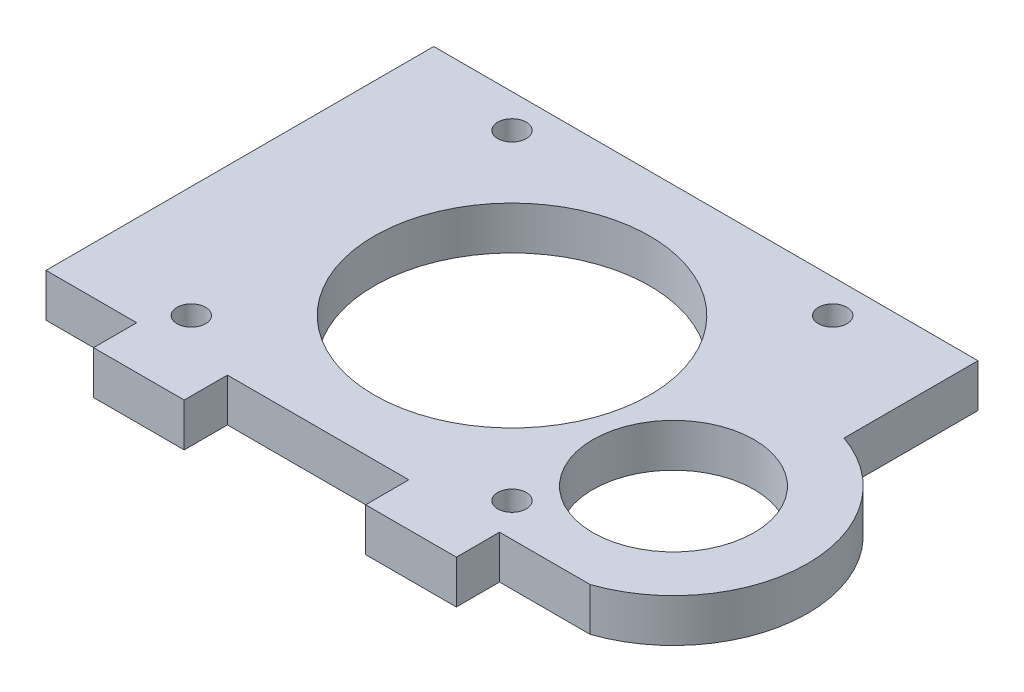
ISO-10303-21;
HEADER;
FILE_DESCRIPTION(('STEP AP214'),'2;1');
FILE_NAME('part.step','',(''),(''),'','','');
FILE_SCHEMA(('AUTOMOTIVE_DESIGN { 1 0 10303 214 1 1 1 1 }'));
ENDSEC;
DATA;
#1=APPLICATION_CONTEXT('core data for automotive mechanical design processes');
#2=APPLICATION_PROTOCOL_DEFINITION('international standard','automotive_design',2000,#1);
#3=PRODUCT_CONTEXT('',#1,'mechanical');
#4=PRODUCT('Part','Part','',(#3));
#5=PRODUCT_RELATED_PRODUCT_CATEGORY('part','',(#4));
#6=PRODUCT_DEFINITION_FORMATION('','',#4);
#7=PRODUCT_DEFINITION_CONTEXT('part definition',#1,'design');
#8=PRODUCT_DEFINITION('design','',#6,#7);
#9=PRODUCT_DEFINITION_SHAPE('','',#8);
#10=(LENGTH_UNIT() NAMED_UNIT(*) SI_UNIT(.MILLI.,.METRE.));
#11=(NAMED_UNIT(*) PLANE_ANGLE_UNIT() SI_UNIT($,.RADIAN.));
#12=(NAMED_UNIT(*) SI_UNIT($,.STERADIAN.) SOLID_ANGLE_UNIT());
#13=UNCERTAINTY_MEASURE_WITH_UNIT(LENGTH_MEASURE(1.E-05),#10,'distance_accuracy_value','');
#14=(GEOMETRIC_REPRESENTATION_CONTEXT(3) GLOBAL_UNCERTAINTY_ASSIGNED_CONTEXT((#13)) GLOBAL_UNIT_ASSIGNED_CONTEXT((#10,
#11,#12)) REPRESENTATION_CONTEXT('',''));
#15=CARTESIAN_POINT('',(0.,0.,0.));
#16=DIRECTION('',(0.,0.,1.));
#17=DIRECTION('',(1.,0.,0.));
#18=AXIS2_PLACEMENT_3D('',#15,#16,#17);
#19=CARTESIAN_POINT('',(-40.,6.35,31.675));
#20=DIRECTION('',(0.,0.,-1.));
#21=DIRECTION('',(-1.,0.,0.));
#22=AXIS2_PLACEMENT_3D('',#19,#20,#21);
#23=PLANE('',#22);
#24=DIRECTION('',(1.,0.,0.));
#25=VECTOR('',#24,1.);
#26=CARTESIAN_POINT('',(-40.,6.35,31.675));
#27=LINE('',#26,#25);
#28=CARTESIAN_POINT('',(-26.6666666666667,6.35,31.675));
#29=VERTEX_POINT('',#28);
#30=CARTESIAN_POINT('',(-13.3333333333333,6.35,31.675));
#31=VERTEX_POINT('',#30);
#32=EDGE_CURVE('E179',#29,#31,#27,.T.);
#33=ORIENTED_EDGE('',*,*,#32,.F.);
#34=DIRECTION('',(0.,1.,0.));
#35=VECTOR('',#34,1.);
#36=CARTESIAN_POINT('',(-26.6666666666667,0.,31.675));
#37=LINE('',#36,#35);
#38=CARTESIAN_POINT('',(-26.6666666666667,0.,31.675));
#39=VERTEX_POINT('',#38);
#40=EDGE_CURVE('E204',#39,#29,#37,.T.);
#41=ORIENTED_EDGE('',*,*,#40,.F.);
#42=DIRECTION('',(1.,0.,0.));
#43=VECTOR('',#42,1.);
#44=CARTESIAN_POINT('',(-40.,0.,31.675));
#45=LINE('',#44,#43);
#46=CARTESIAN_POINT('',(-13.3333333333333,0.,31.675));
#47=VERTEX_POINT('',#46);
#48=EDGE_CURVE('E163',#39,#47,#45,.T.);
#49=ORIENTED_EDGE('',*,*,#48,.T.);
#50=DIRECTION('',(0.,1.,0.));
#51=VECTOR('',#50,1.);
#52=CARTESIAN_POINT('',(-13.3333333333333,0.,31.675));
#53=LINE('',#52,#51);
#54=EDGE_CURVE('E206',#47,#31,#53,.T.);
#55=ORIENTED_EDGE('',*,*,#54,.T.);
#56=EDGE_LOOP('',(#33,#41,#49,#55));
#57=FACE_BOUND('',#56,.T.);
#58=ADVANCED_FACE('F45',(#57),#23,.F.);
#59=CARTESIAN_POINT('',(40.,6.35,-31.675));
#60=DIRECTION('',(-1.,0.,0.));
#61=DIRECTION('',(0.,0.,1.));
#62=AXIS2_PLACEMENT_3D('',#59,#60,#61);
#63=PLANE('',#62);
#64=DIRECTION('',(0.,0.,-1.));
#65=VECTOR('',#64,1.);
#66=CARTESIAN_POINT('',(40.,6.35,-31.675));
#67=LINE('',#66,#65);
#68=CARTESIAN_POINT('',(40.,6.35,-11.975));
#69=VERTEX_POINT('',#68);
#70=CARTESIAN_POINT('',(40.,6.35,-31.675));
#71=VERTEX_POINT('',#70);
#72=EDGE_CURVE('E144',#69,#71,#67,.T.);
#73=ORIENTED_EDGE('',*,*,#72,.F.);
#74=DIRECTION('',(0.,-1.,0.));
#75=VECTOR('',#74,1.);
#76=CARTESIAN_POINT('',(40.,45.9528379593739,-11.975));
#77=LINE('',#76,#75);
#78=CARTESIAN_POINT('',(40.,0.,-11.975));
#79=VERTEX_POINT('',#78);
#80=EDGE_CURVE('E152',#69,#79,#77,.T.);
#81=ORIENTED_EDGE('',*,*,#80,.T.);
#82=DIRECTION('',(0.,0.,-1.));
#83=VECTOR('',#82,1.);
#84=CARTESIAN_POINT('',(40.,0.,-31.675));
#85=LINE('',#84,#83);
#86=CARTESIAN_POINT('',(40.,0.,-31.675));
#87=VERTEX_POINT('',#86);
#88=EDGE_CURVE('E180',#79,#87,#85,.T.);
#89=ORIENTED_EDGE('',*,*,#88,.T.);
#90=DIRECTION('',(0.,-1.,0.));
#91=VECTOR('',#90,1.);
#92=CARTESIAN_POINT('',(40.,6.35,-31.675));
#93=LINE('',#92,#91);
#94=EDGE_CURVE('E11',#71,#87,#93,.T.);
#95=ORIENTED_EDGE('',*,*,#94,.F.);
#96=EDGE_LOOP('',(#73,#81,#89,#95));
#97=FACE_BOUND('',#96,.T.);
#98=ADVANCED_FACE('F47',(#97),#63,.F.);
#99=CARTESIAN_POINT('',(-40.,6.35,-31.675));
#100=DIRECTION('',(0.,0.,1.));
#101=DIRECTION('',(1.,0.,0.));
#102=AXIS2_PLACEMENT_3D('',#99,#100,#101);
#103=PLANE('',#102);
#104=DIRECTION('',(-1.,0.,0.));
#105=VECTOR('',#104,1.);
#106=CARTESIAN_POINT('',(-40.,0.,-31.675));
#107=LINE('',#106,#105);
#108=CARTESIAN_POINT('',(-40.,0.,-31.675));
#109=VERTEX_POINT('',#108);
#110=EDGE_CURVE('E182',#87,#109,#107,.T.);
#111=ORIENTED_EDGE('',*,*,#110,.T.);
#112=DIRECTION('',(0.,-1.,0.));
#113=VECTOR('',#112,1.);
#114=CARTESIAN_POINT('',(-40.,6.35,-31.675));
#115=LINE('',#114,#113);
#116=CARTESIAN_POINT('',(-40.,6.35,-31.675));
#117=VERTEX_POINT('',#116);
#118=EDGE_CURVE('E53',#117,#109,#115,.T.);
#119=ORIENTED_EDGE('',*,*,#118,.F.);
#120=DIRECTION('',(-1.,0.,0.));
#121=VECTOR('',#120,1.);
#122=CARTESIAN_POINT('',(-40.,6.35,-31.675));
#123=LINE('',#122,#121);
#124=EDGE_CURVE('E162',#71,#117,#123,.T.);
#125=ORIENTED_EDGE('',*,*,#124,.F.);
#126=ORIENTED_EDGE('',*,*,#94,.T.);
#127=EDGE_LOOP('',(#111,#119,#125,#126));
#128=FACE_BOUND('',#127,.T.);
#129=ADVANCED_FACE('F347',(#128),#103,.F.);
#130=CARTESIAN_POINT('',(-40.,6.35,-31.675));
#131=DIRECTION('',(1.,0.,0.));
#132=DIRECTION('',(0.,0.,-1.));
#133=AXIS2_PLACEMENT_3D('',#130,#131,#132);
#134=PLANE('',#133);
#135=DIRECTION('',(0.,0.,1.));
#136=VECTOR('',#135,1.);
#137=CARTESIAN_POINT('',(-40.,0.,-31.675));
#138=LINE('',#137,#136);
#139=CARTESIAN_POINT('',(-40.,0.,25.325));
#140=VERTEX_POINT('',#139);
#141=EDGE_CURVE('E185',#109,#140,#138,.T.);
#142=ORIENTED_EDGE('',*,*,#141,.T.);
#143=DIRECTION('',(0.,1.,0.));
#144=VECTOR('',#143,1.);
#145=CARTESIAN_POINT('',(-40.,0.,25.325));
#146=LINE('',#145,#144);
#147=CARTESIAN_POINT('',(-40.,6.35,25.325));
#148=VERTEX_POINT('',#147);
#149=EDGE_CURVE('E183',#140,#148,#146,.T.);
#150=ORIENTED_EDGE('',*,*,#149,.T.);
#151=DIRECTION('',(0.,0.,1.));
#152=VECTOR('',#151,1.);
#153=CARTESIAN_POINT('',(-40.,6.35,-31.675));
#154=LINE('',#153,#152);
#155=EDGE_CURVE('E165',#117,#148,#154,.T.);
#156=ORIENTED_EDGE('',*,*,#155,.F.);
#157=ORIENTED_EDGE('',*,*,#118,.T.);
#158=EDGE_LOOP('',(#142,#150,#156,#157));
#159=FACE_BOUND('',#158,.T.);
#160=ADVANCED_FACE('F350',(#159),#134,.F.);
#161=CARTESIAN_POINT('',(13.3333333333333,0.,31.675));
#162=VERTEX_POINT('',#161);
#163=CARTESIAN_POINT('',(26.6666666666667,0.,31.675));
#164=VERTEX_POINT('',#163);
#165=EDGE_CURVE('E168',#162,#164,#45,.T.);
#166=ORIENTED_EDGE('',*,*,#165,.T.);
#167=DIRECTION('',(0.,1.,0.));
#168=VECTOR('',#167,1.);
#169=CARTESIAN_POINT('',(26.6666666666667,0.,31.675));
#170=LINE('',#169,#168);
#171=CARTESIAN_POINT('',(26.6666666666667,6.35,31.675));
#172=VERTEX_POINT('',#171);
#173=EDGE_CURVE('E232',#164,#172,#170,.T.);
#174=ORIENTED_EDGE('',*,*,#173,.T.);
#175=CARTESIAN_POINT('',(13.3333333333333,6.35,31.675));
#176=VERTEX_POINT('',#175);
#177=EDGE_CURVE('E176',#176,#172,#27,.T.);
#178=ORIENTED_EDGE('',*,*,#177,.F.);
#179=DIRECTION('',(0.,1.,0.));
#180=VECTOR('',#179,1.);
#181=CARTESIAN_POINT('',(13.3333333333333,0.,31.675));
#182=LINE('',#181,#180);
#183=EDGE_CURVE('E211',#162,#176,#182,.T.);
#184=ORIENTED_EDGE('',*,*,#183,.F.);
#185=EDGE_LOOP('',(#166,#174,#178,#184));
#186=FACE_BOUND('',#185,.T.);
#187=ADVANCED_FACE('F248',(#186),#23,.F.);
#188=CARTESIAN_POINT('',(0.,6.35,0.));
#189=DIRECTION('',(0.,1.,0.));
#190=DIRECTION('',(0.,0.,1.));
#191=AXIS2_PLACEMENT_3D('',#188,#189,#190);
#192=PLANE('',#191);
#193=CARTESIAN_POINT('',(33.5853762819475,6.35,6.67500000000001));
#194=DIRECTION('',(0.,1.,0.));
#195=DIRECTION('',(0.,0.,1.));
#196=AXIS2_PLACEMENT_3D('',#193,#194,#195);
#197=CIRCLE('',#196,11.85);
#198=CARTESIAN_POINT('',(33.5853762819475,6.35,18.525));
#199=VERTEX_POINT('',#198);
#200=EDGE_CURVE('E301',#199,#199,#197,.T.);
#201=ORIENTED_EDGE('',*,*,#200,.F.);
#202=EDGE_LOOP('',(#201));
#203=FACE_BOUND('',#202,.T.);
#204=CARTESIAN_POINT('',(23.57,6.35,20.395));
#205=DIRECTION('',(0.,1.,0.));
#206=DIRECTION('',(0.,0.,1.));
#207=AXIS2_PLACEMENT_3D('',#204,#205,#206);
#208=CIRCLE('',#207,2.1);
#209=CARTESIAN_POINT('',(23.57,6.35,22.495));
#210=VERTEX_POINT('',#209);
#211=EDGE_CURVE('E286',#210,#210,#208,.T.);
#212=ORIENTED_EDGE('',*,*,#211,.F.);
#213=EDGE_LOOP('',(#212));
#214=FACE_BOUND('',#213,.T.);
#215=CARTESIAN_POINT('',(-23.57,6.35,20.395));
#216=DIRECTION('',(0.,1.,0.));
#217=DIRECTION('',(0.,0.,1.));
#218=AXIS2_PLACEMENT_3D('',#215,#216,#217);
#219=CIRCLE('',#218,2.1);
#220=CARTESIAN_POINT('',(-23.57,6.35,22.495));
#221=VERTEX_POINT('',#220);
#222=EDGE_CURVE('E292',#221,#221,#219,.T.);
#223=ORIENTED_EDGE('',*,*,#222,.F.);
#224=EDGE_LOOP('',(#223));
#225=FACE_BOUND('',#224,.T.);
#226=CARTESIAN_POINT('',(-23.57,6.35,-26.745));
#227=DIRECTION('',(0.,1.,0.));
#228=DIRECTION('',(0.,0.,1.));
#229=AXIS2_PLACEMENT_3D('',#226,#227,#228);
#230=CIRCLE('',#229,2.1);
#231=CARTESIAN_POINT('',(-23.57,6.35,-24.645));
#232=VERTEX_POINT('',#231);
#233=EDGE_CURVE('E281',#232,#232,#230,.T.);
#234=ORIENTED_EDGE('',*,*,#233,.F.);
#235=EDGE_LOOP('',(#234));
#236=FACE_BOUND('',#235,.T.);
#237=CARTESIAN_POINT('',(23.57,6.35,-26.745));
#238=DIRECTION('',(0.,1.,0.));
#239=DIRECTION('',(0.,0.,1.));
#240=AXIS2_PLACEMENT_3D('',#237,#238,#239);
#241=CIRCLE('',#240,2.1);
#242=CARTESIAN_POINT('',(23.57,6.35,-24.645));
#243=VERTEX_POINT('',#242);
#244=EDGE_CURVE('E278',#243,#243,#241,.T.);
#245=ORIENTED_EDGE('',*,*,#244,.F.);
#246=EDGE_LOOP('',(#245));
#247=FACE_BOUND('',#246,.T.);
#248=CARTESIAN_POINT('',(0.,6.35,-3.17499999999998));
#249=DIRECTION('',(0.,1.,0.));
#250=DIRECTION('',(0.,0.,1.));
#251=AXIS2_PLACEMENT_3D('',#248,#249,#250);
#252=CIRCLE('',#251,20.25);
#253=CARTESIAN_POINT('',(0.,6.35,17.075));
#254=VERTEX_POINT('',#253);
#255=EDGE_CURVE('E225',#254,#254,#252,.T.);
#256=ORIENTED_EDGE('',*,*,#255,.F.);
#257=EDGE_LOOP('',(#256));
#258=FACE_BOUND('',#257,.T.);
#259=DIRECTION('',(-1.,0.,0.));
#260=VECTOR('',#259,1.);
#261=CARTESIAN_POINT('',(-40.,6.35,25.325));
#262=LINE('',#261,#260);
#263=CARTESIAN_POINT('',(-26.6666666666667,6.35,25.325));
#264=VERTEX_POINT('',#263);
#265=EDGE_CURVE('E266',#264,#148,#262,.T.);
#266=ORIENTED_EDGE('',*,*,#265,.F.);
#267=DIRECTION('',(0.,0.,-1.));
#268=VECTOR('',#267,1.);
#269=CARTESIAN_POINT('',(-26.6666666666667,6.35,31.675));
#270=LINE('',#269,#268);
#271=EDGE_CURVE('E200',#29,#264,#270,.T.);
#272=ORIENTED_EDGE('',*,*,#271,.F.);
#273=ORIENTED_EDGE('',*,*,#32,.T.);
#274=DIRECTION('',(0.,0.,1.));
#275=VECTOR('',#274,1.);
#276=CARTESIAN_POINT('',(-13.3333333333333,6.35,31.675));
#277=LINE('',#276,#275);
#278=CARTESIAN_POINT('',(-13.3333333333333,6.35,25.325));
#279=VERTEX_POINT('',#278);
#280=EDGE_CURVE('E198',#279,#31,#277,.T.);
#281=ORIENTED_EDGE('',*,*,#280,.F.);
#282=DIRECTION('',(-1.,0.,0.));
#283=VECTOR('',#282,1.);
#284=CARTESIAN_POINT('',(-13.3333333333333,6.35,25.325));
#285=LINE('',#284,#283);
#286=CARTESIAN_POINT('',(13.3333333333333,6.35,25.325));
#287=VERTEX_POINT('',#286);
#288=EDGE_CURVE('E226',#287,#279,#285,.T.);
#289=ORIENTED_EDGE('',*,*,#288,.F.);
#290=DIRECTION('',(0.,0.,-1.));
#291=VECTOR('',#290,1.);
#292=CARTESIAN_POINT('',(13.3333333333333,6.35,31.675));
#293=LINE('',#292,#291);
#294=EDGE_CURVE('E229',#176,#287,#293,.T.);
#295=ORIENTED_EDGE('',*,*,#294,.F.);
#296=ORIENTED_EDGE('',*,*,#177,.T.);
#297=DIRECTION('',(0.,0.,1.));
#298=VECTOR('',#297,1.);
#299=CARTESIAN_POINT('',(26.6666666666667,6.35,31.675));
#300=LINE('',#299,#298);
#301=CARTESIAN_POINT('',(26.6666666666667,6.35,25.325));
#302=VERTEX_POINT('',#301);
#303=EDGE_CURVE('E255',#302,#172,#300,.T.);
#304=ORIENTED_EDGE('',*,*,#303,.F.);
#305=DIRECTION('',(-1.,0.,0.));
#306=VECTOR('',#305,1.);
#307=CARTESIAN_POINT('',(40.,6.35,25.325));
#308=LINE('',#307,#306);
#309=CARTESIAN_POINT('',(40.,6.35,25.325));
#310=VERTEX_POINT('',#309);
#311=EDGE_CURVE('E148',#310,#302,#308,.T.);
#312=ORIENTED_EDGE('',*,*,#311,.F.);
#313=CARTESIAN_POINT('',(33.5853762819475,6.35,6.67500000000001));
#314=DIRECTION('',(0.,1.,0.));
#315=DIRECTION('',(0.,0.,1.));
#316=AXIS2_PLACEMENT_3D('',#313,#314,#315);
#317=CIRCLE('',#316,19.7223197784693);
#318=EDGE_CURVE('E139',#69,#310,#317,.F.);
#319=ORIENTED_EDGE('',*,*,#318,.F.);
#320=ORIENTED_EDGE('',*,*,#72,.T.);
#321=ORIENTED_EDGE('',*,*,#124,.T.);
#322=ORIENTED_EDGE('',*,*,#155,.T.);
#323=EDGE_LOOP('',(#266,#272,#273,#281,#289,#295,#296,#304,#312,#319,#320,#321,#322));
#324=FACE_BOUND('',#323,.T.);
#325=ADVANCED_FACE('F142',(#203,#214,#225,#236,#247,#258,#324),#192,.T.);
#326=CARTESIAN_POINT('',(0.,0.,0.));
#327=DIRECTION('',(0.,1.,0.));
#328=DIRECTION('',(0.,0.,1.));
#329=AXIS2_PLACEMENT_3D('',#326,#327,#328);
#330=PLANE('',#329);
#331=CARTESIAN_POINT('',(33.5853762819475,0.,6.67500000000001));
#332=DIRECTION('',(0.,-1.,0.));
#333=DIRECTION('',(0.,0.,-1.));
#334=AXIS2_PLACEMENT_3D('',#331,#332,#333);
#335=CIRCLE('',#334,11.85);
#336=CARTESIAN_POINT('',(33.5853762819475,0.,-5.17499999999999));
#337=VERTEX_POINT('',#336);
#338=EDGE_CURVE('E304',#337,#337,#335,.T.);
#339=ORIENTED_EDGE('',*,*,#338,.F.);
#340=EDGE_LOOP('',(#339));
#341=FACE_BOUND('',#340,.T.);
#342=CARTESIAN_POINT('',(23.57,0.,20.395));
#343=DIRECTION('',(0.,1.,0.));
#344=DIRECTION('',(0.,0.,1.));
#345=AXIS2_PLACEMENT_3D('',#342,#343,#344);
#346=CIRCLE('',#345,2.1);
#347=CARTESIAN_POINT('',(23.57,0.,22.495));
#348=VERTEX_POINT('',#347);
#349=EDGE_CURVE('E151',#348,#348,#346,.T.);
#350=ORIENTED_EDGE('',*,*,#349,.T.);
#351=EDGE_LOOP('',(#350));
#352=FACE_BOUND('',#351,.T.);
#353=CARTESIAN_POINT('',(-23.57,0.,20.395));
#354=DIRECTION('',(0.,1.,0.));
#355=DIRECTION('',(0.,0.,1.));
#356=AXIS2_PLACEMENT_3D('',#353,#354,#355);
#357=CIRCLE('',#356,2.1);
#358=CARTESIAN_POINT('',(-23.57,0.,22.495));
#359=VERTEX_POINT('',#358);
#360=EDGE_CURVE('E289',#359,#359,#357,.T.);
#361=ORIENTED_EDGE('',*,*,#360,.T.);
#362=EDGE_LOOP('',(#361));
#363=FACE_BOUND('',#362,.T.);
#364=CARTESIAN_POINT('',(-23.57,0.,-26.745));
#365=DIRECTION('',(0.,1.,0.));
#366=DIRECTION('',(0.,0.,1.));
#367=AXIS2_PLACEMENT_3D('',#364,#365,#366);
#368=CIRCLE('',#367,2.1);
#369=CARTESIAN_POINT('',(-23.57,0.,-24.645));
#370=VERTEX_POINT('',#369);
#371=EDGE_CURVE('E295',#370,#370,#368,.T.);
#372=ORIENTED_EDGE('',*,*,#371,.T.);
#373=EDGE_LOOP('',(#372));
#374=FACE_BOUND('',#373,.T.);
#375=CARTESIAN_POINT('',(23.57,0.,-26.745));
#376=DIRECTION('',(0.,1.,0.));
#377=DIRECTION('',(0.,0.,1.));
#378=AXIS2_PLACEMENT_3D('',#375,#376,#377);
#379=CIRCLE('',#378,2.1);
#380=CARTESIAN_POINT('',(23.57,0.,-24.645));
#381=VERTEX_POINT('',#380);
#382=EDGE_CURVE('E277',#381,#381,#379,.T.);
#383=ORIENTED_EDGE('',*,*,#382,.T.);
#384=EDGE_LOOP('',(#383));
#385=FACE_BOUND('',#384,.T.);
#386=CARTESIAN_POINT('',(0.,0.,-3.17499999999998));
#387=DIRECTION('',(0.,1.,0.));
#388=DIRECTION('',(0.,0.,1.));
#389=AXIS2_PLACEMENT_3D('',#386,#387,#388);
#390=CIRCLE('',#389,20.25);
#391=CARTESIAN_POINT('',(0.,0.,17.075));
#392=VERTEX_POINT('',#391);
#393=EDGE_CURVE('E274',#392,#392,#390,.T.);
#394=ORIENTED_EDGE('',*,*,#393,.T.);
#395=EDGE_LOOP('',(#394));
#396=FACE_BOUND('',#395,.T.);
#397=DIRECTION('',(0.,0.,-1.));
#398=VECTOR('',#397,1.);
#399=CARTESIAN_POINT('',(-26.6666666666667,0.,31.675));
#400=LINE('',#399,#398);
#401=CARTESIAN_POINT('',(-26.6666666666667,0.,25.325));
#402=VERTEX_POINT('',#401);
#403=EDGE_CURVE('E268',#39,#402,#400,.T.);
#404=ORIENTED_EDGE('',*,*,#403,.T.);
#405=DIRECTION('',(-1.,0.,0.));
#406=VECTOR('',#405,1.);
#407=CARTESIAN_POINT('',(-40.,0.,25.325));
#408=LINE('',#407,#406);
#409=EDGE_CURVE('E60',#402,#140,#408,.T.);
#410=ORIENTED_EDGE('',*,*,#409,.T.);
#411=ORIENTED_EDGE('',*,*,#141,.F.);
#412=ORIENTED_EDGE('',*,*,#110,.F.);
#413=ORIENTED_EDGE('',*,*,#88,.F.);
#414=CARTESIAN_POINT('',(33.5853762819475,0.,6.67500000000001));
#415=DIRECTION('',(0.,-1.,0.));
#416=DIRECTION('',(0.,0.,-1.));
#417=AXIS2_PLACEMENT_3D('',#414,#415,#416);
#418=CIRCLE('',#417,19.7223197784693);
#419=CARTESIAN_POINT('',(40.,0.,25.325));
#420=VERTEX_POINT('',#419);
#421=EDGE_CURVE('E157',#79,#420,#418,.T.);
#422=ORIENTED_EDGE('',*,*,#421,.T.);
#423=DIRECTION('',(-1.,0.,0.));
#424=VECTOR('',#423,1.);
#425=CARTESIAN_POINT('',(40.,0.,25.325));
#426=LINE('',#425,#424);
#427=CARTESIAN_POINT('',(26.6666666666667,0.,25.325));
#428=VERTEX_POINT('',#427);
#429=EDGE_CURVE('E219',#420,#428,#426,.T.);
#430=ORIENTED_EDGE('',*,*,#429,.T.);
#431=DIRECTION('',(0.,0.,1.));
#432=VECTOR('',#431,1.);
#433=CARTESIAN_POINT('',(26.6666666666667,0.,31.675));
#434=LINE('',#433,#432);
#435=EDGE_CURVE('E68',#428,#164,#434,.T.);
#436=ORIENTED_EDGE('',*,*,#435,.T.);
#437=ORIENTED_EDGE('',*,*,#165,.F.);
#438=DIRECTION('',(0.,0.,-1.));
#439=VECTOR('',#438,1.);
#440=CARTESIAN_POINT('',(13.3333333333333,0.,31.675));
#441=LINE('',#440,#439);
#442=CARTESIAN_POINT('',(13.3333333333333,0.,25.325));
#443=VERTEX_POINT('',#442);
#444=EDGE_CURVE('E214',#162,#443,#441,.T.);
#445=ORIENTED_EDGE('',*,*,#444,.T.);
#446=DIRECTION('',(-1.,0.,0.));
#447=VECTOR('',#446,1.);
#448=CARTESIAN_POINT('',(-13.3333333333333,0.,25.325));
#449=LINE('',#448,#447);
#450=CARTESIAN_POINT('',(-13.3333333333333,0.,25.325));
#451=VERTEX_POINT('',#450);
#452=EDGE_CURVE('E210',#443,#451,#449,.T.);
#453=ORIENTED_EDGE('',*,*,#452,.T.);
#454=DIRECTION('',(0.,0.,1.));
#455=VECTOR('',#454,1.);
#456=CARTESIAN_POINT('',(-13.3333333333333,0.,31.675));
#457=LINE('',#456,#455);
#458=EDGE_CURVE('E171',#451,#47,#457,.T.);
#459=ORIENTED_EDGE('',*,*,#458,.T.);
#460=ORIENTED_EDGE('',*,*,#48,.F.);
#461=EDGE_LOOP('',(#404,#410,#411,#412,#413,#422,#430,#436,#437,#445,#453,#459,#460));
#462=FACE_BOUND('',#461,.T.);
#463=ADVANCED_FACE('F237',(#341,#352,#363,#374,#385,#396,#462),#330,.F.);
#464=CARTESIAN_POINT('',(-13.3333333333333,0.,31.675));
#465=DIRECTION('',(-1.,0.,0.));
#466=DIRECTION('',(0.,0.,1.));
#467=AXIS2_PLACEMENT_3D('',#464,#465,#466);
#468=PLANE('',#467);
#469=ORIENTED_EDGE('',*,*,#280,.T.);
#470=ORIENTED_EDGE('',*,*,#54,.F.);
#471=ORIENTED_EDGE('',*,*,#458,.F.);
#472=DIRECTION('',(0.,1.,0.));
#473=VECTOR('',#472,1.);
#474=CARTESIAN_POINT('',(-13.3333333333333,0.,25.325));
#475=LINE('',#474,#473);
#476=EDGE_CURVE('E223',#451,#279,#475,.T.);
#477=ORIENTED_EDGE('',*,*,#476,.T.);
#478=EDGE_LOOP('',(#469,#470,#471,#477));
#479=FACE_BOUND('',#478,.T.);
#480=ADVANCED_FACE('F238',(#479),#468,.F.);
#481=CARTESIAN_POINT('',(-13.3333333333333,0.,25.325));
#482=DIRECTION('',(0.,0.,-1.));
#483=DIRECTION('',(-1.,0.,0.));
#484=AXIS2_PLACEMENT_3D('',#481,#482,#483);
#485=PLANE('',#484);
#486=ORIENTED_EDGE('',*,*,#288,.T.);
#487=ORIENTED_EDGE('',*,*,#476,.F.);
#488=ORIENTED_EDGE('',*,*,#452,.F.);
#489=DIRECTION('',(0.,1.,0.));
#490=VECTOR('',#489,1.);
#491=CARTESIAN_POINT('',(13.3333333333333,0.,25.325));
#492=LINE('',#491,#490);
#493=EDGE_CURVE('E216',#443,#287,#492,.T.);
#494=ORIENTED_EDGE('',*,*,#493,.T.);
#495=EDGE_LOOP('',(#486,#487,#488,#494));
#496=FACE_BOUND('',#495,.T.);
#497=ADVANCED_FACE('F240',(#496),#485,.F.);
#498=CARTESIAN_POINT('',(13.3333333333333,0.,31.675));
#499=DIRECTION('',(1.,0.,0.));
#500=DIRECTION('',(0.,0.,-1.));
#501=AXIS2_PLACEMENT_3D('',#498,#499,#500);
#502=PLANE('',#501);
#503=ORIENTED_EDGE('',*,*,#294,.T.);
#504=ORIENTED_EDGE('',*,*,#493,.F.);
#505=ORIENTED_EDGE('',*,*,#444,.F.);
#506=ORIENTED_EDGE('',*,*,#183,.T.);
#507=EDGE_LOOP('',(#503,#504,#505,#506));
#508=FACE_BOUND('',#507,.T.);
#509=ADVANCED_FACE('F371',(#508),#502,.F.);
#510=CARTESIAN_POINT('',(26.6666666666667,0.,31.675));
#511=DIRECTION('',(-1.,0.,0.));
#512=DIRECTION('',(0.,0.,1.));
#513=AXIS2_PLACEMENT_3D('',#510,#511,#512);
#514=PLANE('',#513);
#515=ORIENTED_EDGE('',*,*,#303,.T.);
#516=ORIENTED_EDGE('',*,*,#173,.F.);
#517=ORIENTED_EDGE('',*,*,#435,.F.);
#518=DIRECTION('',(0.,1.,0.));
#519=VECTOR('',#518,1.);
#520=CARTESIAN_POINT('',(26.6666666666667,0.,25.325));
#521=LINE('',#520,#519);
#522=EDGE_CURVE('E249',#428,#302,#521,.T.);
#523=ORIENTED_EDGE('',*,*,#522,.T.);
#524=EDGE_LOOP('',(#515,#516,#517,#523));
#525=FACE_BOUND('',#524,.T.);
#526=ADVANCED_FACE('F367',(#525),#514,.F.);
#527=CARTESIAN_POINT('',(40.,0.,25.325));
#528=DIRECTION('',(0.,0.,-1.));
#529=DIRECTION('',(-1.,0.,0.));
#530=AXIS2_PLACEMENT_3D('',#527,#528,#529);
#531=PLANE('',#530);
#532=ORIENTED_EDGE('',*,*,#311,.T.);
#533=ORIENTED_EDGE('',*,*,#522,.F.);
#534=ORIENTED_EDGE('',*,*,#429,.F.);
#535=DIRECTION('',(0.,1.,0.));
#536=VECTOR('',#535,1.);
#537=CARTESIAN_POINT('',(40.,0.,25.325));
#538=LINE('',#537,#536);
#539=EDGE_CURVE('E251',#420,#310,#538,.T.);
#540=ORIENTED_EDGE('',*,*,#539,.T.);
#541=EDGE_LOOP('',(#532,#533,#534,#540));
#542=FACE_BOUND('',#541,.T.);
#543=ADVANCED_FACE('F362',(#542),#531,.F.);
#544=CARTESIAN_POINT('',(-40.,0.,25.325));
#545=DIRECTION('',(0.,0.,-1.));
#546=DIRECTION('',(-1.,0.,0.));
#547=AXIS2_PLACEMENT_3D('',#544,#545,#546);
#548=PLANE('',#547);
#549=ORIENTED_EDGE('',*,*,#265,.T.);
#550=ORIENTED_EDGE('',*,*,#149,.F.);
#551=ORIENTED_EDGE('',*,*,#409,.F.);
#552=DIRECTION('',(0.,1.,0.));
#553=VECTOR('',#552,1.);
#554=CARTESIAN_POINT('',(-26.6666666666667,0.,25.325));
#555=LINE('',#554,#553);
#556=EDGE_CURVE('E262',#402,#264,#555,.T.);
#557=ORIENTED_EDGE('',*,*,#556,.T.);
#558=EDGE_LOOP('',(#549,#550,#551,#557));
#559=FACE_BOUND('',#558,.T.);
#560=ADVANCED_FACE('F336',(#559),#548,.F.);
#561=CARTESIAN_POINT('',(-26.6666666666667,0.,31.675));
#562=DIRECTION('',(1.,0.,0.));
#563=DIRECTION('',(0.,0.,-1.));
#564=AXIS2_PLACEMENT_3D('',#561,#562,#563);
#565=PLANE('',#564);
#566=ORIENTED_EDGE('',*,*,#271,.T.);
#567=ORIENTED_EDGE('',*,*,#556,.F.);
#568=ORIENTED_EDGE('',*,*,#403,.F.);
#569=ORIENTED_EDGE('',*,*,#40,.T.);
#570=EDGE_LOOP('',(#566,#567,#568,#569));
#571=FACE_BOUND('',#570,.T.);
#572=ADVANCED_FACE('F326',(#571),#565,.F.);
#573=CARTESIAN_POINT('',(0.,3.8,-3.17499999999998));
#574=DIRECTION('',(0.,1.,0.));
#575=DIRECTION('',(0.,0.,1.));
#576=AXIS2_PLACEMENT_3D('',#573,#574,#575);
#577=CYLINDRICAL_SURFACE('',#576,20.25);
#578=ORIENTED_EDGE('',*,*,#255,.T.);
#579=EDGE_LOOP('',(#578));
#580=FACE_BOUND('',#579,.T.);
#581=ORIENTED_EDGE('',*,*,#393,.F.);
#582=EDGE_LOOP('',(#581));
#583=FACE_BOUND('',#582,.T.);
#584=ADVANCED_FACE('F323',(#580,#583),#577,.F.);
#585=CARTESIAN_POINT('',(23.57,0.,-26.745));
#586=DIRECTION('',(0.,1.,0.));
#587=DIRECTION('',(0.,0.,1.));
#588=AXIS2_PLACEMENT_3D('',#585,#586,#587);
#589=CYLINDRICAL_SURFACE('',#588,2.1);
#590=ORIENTED_EDGE('',*,*,#382,.F.);
#591=EDGE_LOOP('',(#590));
#592=FACE_BOUND('',#591,.T.);
#593=ORIENTED_EDGE('',*,*,#244,.T.);
#594=EDGE_LOOP('',(#593));
#595=FACE_BOUND('',#594,.T.);
#596=ADVANCED_FACE('F325',(#592,#595),#589,.F.);
#597=CARTESIAN_POINT('',(-23.57,0.,-26.745));
#598=DIRECTION('',(0.,1.,0.));
#599=DIRECTION('',(0.,0.,1.));
#600=AXIS2_PLACEMENT_3D('',#597,#598,#599);
#601=CYLINDRICAL_SURFACE('',#600,2.1);
#602=ORIENTED_EDGE('',*,*,#371,.F.);
#603=EDGE_LOOP('',(#602));
#604=FACE_BOUND('',#603,.T.);
#605=ORIENTED_EDGE('',*,*,#233,.T.);
#606=EDGE_LOOP('',(#605));
#607=FACE_BOUND('',#606,.T.);
#608=ADVANCED_FACE('F333',(#604,#607),#601,.F.);
#609=CARTESIAN_POINT('',(-23.57,0.,20.395));
#610=DIRECTION('',(0.,1.,0.));
#611=DIRECTION('',(0.,0.,1.));
#612=AXIS2_PLACEMENT_3D('',#609,#610,#611);
#613=CYLINDRICAL_SURFACE('',#612,2.1);
#614=ORIENTED_EDGE('',*,*,#360,.F.);
#615=EDGE_LOOP('',(#614));
#616=FACE_BOUND('',#615,.T.);
#617=ORIENTED_EDGE('',*,*,#222,.T.);
#618=EDGE_LOOP('',(#617));
#619=FACE_BOUND('',#618,.T.);
#620=ADVANCED_FACE('F430',(#616,#619),#613,.F.);
#621=CARTESIAN_POINT('',(23.57,0.,20.395));
#622=DIRECTION('',(0.,1.,0.));
#623=DIRECTION('',(0.,0.,1.));
#624=AXIS2_PLACEMENT_3D('',#621,#622,#623);
#625=CYLINDRICAL_SURFACE('',#624,2.1);
#626=ORIENTED_EDGE('',*,*,#349,.F.);
#627=EDGE_LOOP('',(#626));
#628=FACE_BOUND('',#627,.T.);
#629=ORIENTED_EDGE('',*,*,#211,.T.);
#630=EDGE_LOOP('',(#629));
#631=FACE_BOUND('',#630,.T.);
#632=ADVANCED_FACE('F440',(#628,#631),#625,.F.);
#633=CARTESIAN_POINT('',(33.5853762819475,45.9528379593739,6.67500000000001));
#634=DIRECTION('',(0.,-1.,0.));
#635=DIRECTION('',(0.,0.,-1.));
#636=AXIS2_PLACEMENT_3D('',#633,#634,#635);
#637=CYLINDRICAL_SURFACE('',#636,19.7223197784693);
#638=ORIENTED_EDGE('',*,*,#80,.F.);
#639=ORIENTED_EDGE('',*,*,#318,.T.);
#640=ORIENTED_EDGE('',*,*,#539,.F.);
#641=ORIENTED_EDGE('',*,*,#421,.F.);
#642=EDGE_LOOP('',(#638,#639,#640,#641));
#643=FACE_BOUND('',#642,.T.);
#644=ADVANCED_FACE('F155',(#643),#637,.T.);
#645=CARTESIAN_POINT('',(33.5853762819475,10.,6.67500000000001));
#646=DIRECTION('',(0.,-1.,0.));
#647=DIRECTION('',(0.,0.,-1.));
#648=AXIS2_PLACEMENT_3D('',#645,#646,#647);
#649=CYLINDRICAL_SURFACE('',#648,11.85);
#650=ORIENTED_EDGE('',*,*,#200,.T.);
#651=EDGE_LOOP('',(#650));
#652=FACE_BOUND('',#651,.T.);
#653=ORIENTED_EDGE('',*,*,#338,.T.);
#654=EDGE_LOOP('',(#653));
#655=FACE_BOUND('',#654,.T.);
#656=ADVANCED_FACE('F308',(#652,#655),#649,.F.);
#657=CLOSED_SHELL('',(#58,#98,#129,#160,#187,#325,#463,#480,#497,#509,#526,#543,#560,#572,#584,
#596,#608,#620,#632,#644,#656));
#658=MANIFOLD_SOLID_BREP('B2',#657);
#659=ADVANCED_BREP_SHAPE_REPRESENTATION('',(#18,#658),#14);
#660=SHAPE_DEFINITION_REPRESENTATION(#9,#659);
ENDSEC;
END-ISO-10303-21;
